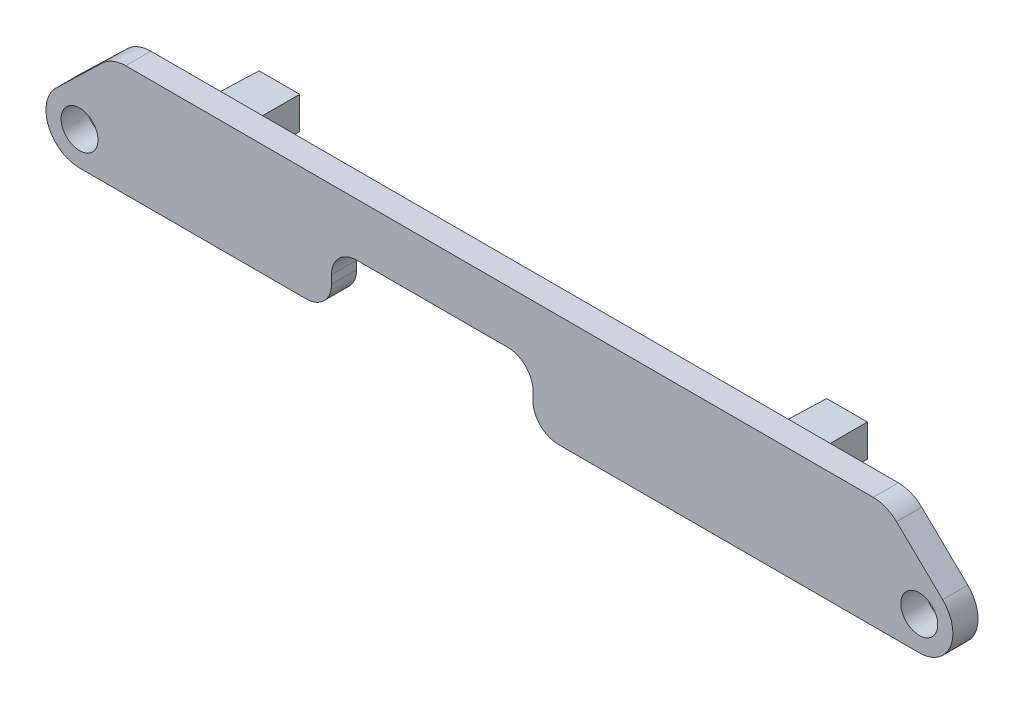
ISO-10303-21;
HEADER;
FILE_DESCRIPTION(('STEP AP214'),'2;1');
FILE_NAME('part.step','',(''),(''),'','','');
FILE_SCHEMA(('AUTOMOTIVE_DESIGN { 1 0 10303 214 1 1 1 1 }'));
ENDSEC;
DATA;
#1=APPLICATION_CONTEXT('core data for automotive mechanical design processes');
#2=APPLICATION_PROTOCOL_DEFINITION('international standard','automotive_design',2000,#1);
#3=PRODUCT_CONTEXT('',#1,'mechanical');
#4=PRODUCT('Part','Part','',(#3));
#5=PRODUCT_RELATED_PRODUCT_CATEGORY('part','',(#4));
#6=PRODUCT_DEFINITION_FORMATION('','',#4);
#7=PRODUCT_DEFINITION_CONTEXT('part definition',#1,'design');
#8=PRODUCT_DEFINITION('design','',#6,#7);
#9=PRODUCT_DEFINITION_SHAPE('','',#8);
#10=(LENGTH_UNIT() NAMED_UNIT(*) SI_UNIT(.MILLI.,.METRE.));
#11=(NAMED_UNIT(*) PLANE_ANGLE_UNIT() SI_UNIT($,.RADIAN.));
#12=(NAMED_UNIT(*) SI_UNIT($,.STERADIAN.) SOLID_ANGLE_UNIT());
#13=UNCERTAINTY_MEASURE_WITH_UNIT(LENGTH_MEASURE(1.E-05),#10,'distance_accuracy_value','');
#14=(GEOMETRIC_REPRESENTATION_CONTEXT(3) GLOBAL_UNCERTAINTY_ASSIGNED_CONTEXT((#13)) GLOBAL_UNIT_ASSIGNED_CONTEXT((#10,
#11,#12)) REPRESENTATION_CONTEXT('',''));
#15=CARTESIAN_POINT('',(0.,0.,0.));
#16=DIRECTION('',(0.,0.,1.));
#17=DIRECTION('',(1.,0.,0.));
#18=AXIS2_PLACEMENT_3D('',#15,#16,#17);
#19=CARTESIAN_POINT('',(-25.,-1.5,-1.5));
#20=DIRECTION('',(0.,0.,1.));
#21=DIRECTION('',(1.,0.,0.));
#22=AXIS2_PLACEMENT_3D('',#19,#20,#21);
#23=PLANE('',#22);
#24=DIRECTION('',(1.,0.,0.));
#25=VECTOR('',#24,1.);
#26=CARTESIAN_POINT('',(18.15,1.1,-1.5));
#27=LINE('',#26,#25);
#28=CARTESIAN_POINT('',(15.65,1.1,-1.5));
#29=VERTEX_POINT('',#28);
#30=CARTESIAN_POINT('',(18.15,1.1,-1.5));
#31=VERTEX_POINT('',#30);
#32=EDGE_CURVE('E207',#29,#31,#27,.T.);
#33=ORIENTED_EDGE('',*,*,#32,.T.);
#34=DIRECTION('',(0.,1.,0.));
#35=VECTOR('',#34,1.);
#36=CARTESIAN_POINT('',(18.15,1.1,-1.5));
#37=LINE('',#36,#35);
#38=CARTESIAN_POINT('',(18.15,3.1,-1.5));
#39=VERTEX_POINT('',#38);
#40=EDGE_CURVE('E219',#31,#39,#37,.T.);
#41=ORIENTED_EDGE('',*,*,#40,.T.);
#42=DIRECTION('',(-1.,0.,0.));
#43=VECTOR('',#42,1.);
#44=CARTESIAN_POINT('',(18.15,3.1,-1.5));
#45=LINE('',#44,#43);
#46=CARTESIAN_POINT('',(15.65,3.1,-1.5));
#47=VERTEX_POINT('',#46);
#48=EDGE_CURVE('E233',#39,#47,#45,.T.);
#49=ORIENTED_EDGE('',*,*,#48,.T.);
#50=DIRECTION('',(0.,-1.,0.));
#51=VECTOR('',#50,1.);
#52=CARTESIAN_POINT('',(15.65,1.1,-1.5));
#53=LINE('',#52,#51);
#54=EDGE_CURVE('E229',#47,#29,#53,.T.);
#55=ORIENTED_EDGE('',*,*,#54,.T.);
#56=EDGE_LOOP('',(#33,#41,#49,#55));
#57=FACE_BOUND('',#56,.T.);
#58=DIRECTION('',(0.,-1.,0.));
#59=VECTOR('',#58,1.);
#60=CARTESIAN_POINT('',(-10.,-3.5,-1.5));
#61=LINE('',#60,#59);
#62=CARTESIAN_POINT('',(-10.,-1.5,-1.5));
#63=VERTEX_POINT('',#62);
#64=CARTESIAN_POINT('',(-10.,-2.,-1.5));
#65=VERTEX_POINT('',#64);
#66=EDGE_CURVE('E322',#63,#65,#61,.T.);
#67=ORIENTED_EDGE('',*,*,#66,.T.);
#68=CARTESIAN_POINT('',(-11.5,-2.,-1.5));
#69=DIRECTION('',(0.,0.,1.));
#70=DIRECTION('',(1.,0.,0.));
#71=AXIS2_PLACEMENT_3D('',#68,#69,#70);
#72=CIRCLE('',#71,1.5);
#73=CARTESIAN_POINT('',(-11.5,-3.5,-1.5));
#74=VERTEX_POINT('',#73);
#75=EDGE_CURVE('E457',#65,#74,#72,.F.);
#76=ORIENTED_EDGE('',*,*,#75,.T.);
#77=DIRECTION('',(1.,0.,0.));
#78=VECTOR('',#77,1.);
#79=CARTESIAN_POINT('',(-25.,-3.5,-1.5));
#80=LINE('',#79,#78);
#81=CARTESIAN_POINT('',(-25.,-3.5,-1.5));
#82=VERTEX_POINT('',#81);
#83=EDGE_CURVE('E343',#82,#74,#80,.T.);
#84=ORIENTED_EDGE('',*,*,#83,.F.);
#85=CARTESIAN_POINT('',(-25.,-1.5,-1.5));
#86=DIRECTION('',(0.,0.,1.));
#87=DIRECTION('',(1.,0.,0.));
#88=AXIS2_PLACEMENT_3D('',#85,#86,#87);
#89=CIRCLE('',#88,2.);
#90=CARTESIAN_POINT('',(-26.389316740918,-0.0613203993226901,-1.5));
#91=VERTEX_POINT('',#90);
#92=EDGE_CURVE('E337',#91,#82,#89,.T.);
#93=ORIENTED_EDGE('',*,*,#92,.F.);
#94=DIRECTION('',(-0.719339800338655,-0.694658370458993,0.));
#95=VECTOR('',#94,1.);
#96=CARTESIAN_POINT('',(-26.389316740918,-0.0613203993226901,-1.5));
#97=LINE('',#96,#95);
#98=CARTESIAN_POINT('',(-23.645161409373,2.5886796006773,-1.5));
#99=VERTEX_POINT('',#98);
#100=EDGE_CURVE('E359',#99,#91,#97,.T.);
#101=ORIENTED_EDGE('',*,*,#100,.F.);
#102=CARTESIAN_POINT('',(-22.255844668455,1.15,-1.5));
#103=DIRECTION('',(0.,0.,1.));
#104=DIRECTION('',(1.,0.,0.));
#105=AXIS2_PLACEMENT_3D('',#102,#103,#104);
#106=CIRCLE('',#105,2.);
#107=CARTESIAN_POINT('',(-22.255844668455,3.15,-1.5));
#108=VERTEX_POINT('',#107);
#109=EDGE_CURVE('E415',#99,#108,#106,.F.);
#110=ORIENTED_EDGE('',*,*,#109,.T.);
#111=DIRECTION('',(-1.,0.,0.));
#112=VECTOR('',#111,1.);
#113=CARTESIAN_POINT('',(23.0638971201253,3.15,-1.5));
#114=LINE('',#113,#112);
#115=CARTESIAN_POINT('',(22.255844668455,3.15,-1.5));
#116=VERTEX_POINT('',#115);
#117=EDGE_CURVE('E355',#116,#108,#114,.T.);
#118=ORIENTED_EDGE('',*,*,#117,.F.);
#119=CARTESIAN_POINT('',(22.255844668455,1.15,-1.5));
#120=DIRECTION('',(0.,0.,1.));
#121=DIRECTION('',(1.,0.,0.));
#122=AXIS2_PLACEMENT_3D('',#119,#120,#121);
#123=CIRCLE('',#122,2.);
#124=CARTESIAN_POINT('',(23.645161409373,2.58867960067731,-1.5));
#125=VERTEX_POINT('',#124);
#126=EDGE_CURVE('E418',#116,#125,#123,.F.);
#127=ORIENTED_EDGE('',*,*,#126,.T.);
#128=DIRECTION('',(-0.719339800338655,0.694658370458993,0.));
#129=VECTOR('',#128,1.);
#130=CARTESIAN_POINT('',(26.389316740918,-0.0613203993226901,-1.5));
#131=LINE('',#130,#129);
#132=CARTESIAN_POINT('',(26.389316740918,-0.0613203993226905,-1.5));
#133=VERTEX_POINT('',#132);
#134=EDGE_CURVE('E351',#133,#125,#131,.T.);
#135=ORIENTED_EDGE('',*,*,#134,.F.);
#136=CARTESIAN_POINT('',(25.,-1.5,-1.5));
#137=DIRECTION('',(0.,0.,1.));
#138=DIRECTION('',(-1.,0.,0.));
#139=AXIS2_PLACEMENT_3D('',#136,#137,#138);
#140=CIRCLE('',#139,2.);
#141=CARTESIAN_POINT('',(25.,-3.5,-1.5));
#142=VERTEX_POINT('',#141);
#143=EDGE_CURVE('E347',#142,#133,#140,.T.);
#144=ORIENTED_EDGE('',*,*,#143,.F.);
#145=CARTESIAN_POINT('',(3.5,-3.5,-1.5));
#146=VERTEX_POINT('',#145);
#147=EDGE_CURVE('E341',#146,#142,#80,.T.);
#148=ORIENTED_EDGE('',*,*,#147,.F.);
#149=CARTESIAN_POINT('',(3.5,-2.,-1.5));
#150=DIRECTION('',(0.,0.,1.));
#151=DIRECTION('',(1.,0.,0.));
#152=AXIS2_PLACEMENT_3D('',#149,#150,#151);
#153=CIRCLE('',#152,1.5);
#154=CARTESIAN_POINT('',(2.,-2.,-1.5));
#155=VERTEX_POINT('',#154);
#156=EDGE_CURVE('E454',#146,#155,#153,.F.);
#157=ORIENTED_EDGE('',*,*,#156,.T.);
#158=DIRECTION('',(0.,1.,0.));
#159=VECTOR('',#158,1.);
#160=CARTESIAN_POINT('',(2.,-3.5,-1.5));
#161=LINE('',#160,#159);
#162=CARTESIAN_POINT('',(2.,-1.5,-1.5));
#163=VERTEX_POINT('',#162);
#164=EDGE_CURVE('E313',#155,#163,#161,.T.);
#165=ORIENTED_EDGE('',*,*,#164,.T.);
#166=CARTESIAN_POINT('',(0.500000000000001,-1.5,-1.5));
#167=DIRECTION('',(0.,0.,1.));
#168=DIRECTION('',(1.,0.,0.));
#169=AXIS2_PLACEMENT_3D('',#166,#167,#168);
#170=CIRCLE('',#169,1.5);
#171=CARTESIAN_POINT('',(0.5,0.,-1.5));
#172=VERTEX_POINT('',#171);
#173=EDGE_CURVE('E465',#163,#172,#170,.T.);
#174=ORIENTED_EDGE('',*,*,#173,.T.);
#175=DIRECTION('',(-1.,0.,0.));
#176=VECTOR('',#175,1.);
#177=CARTESIAN_POINT('',(2.,0.,-1.5));
#178=LINE('',#177,#176);
#179=CARTESIAN_POINT('',(-8.5,0.,-1.5));
#180=VERTEX_POINT('',#179);
#181=EDGE_CURVE('E317',#172,#180,#178,.T.);
#182=ORIENTED_EDGE('',*,*,#181,.T.);
#183=CARTESIAN_POINT('',(-8.5,-1.5,-1.5));
#184=DIRECTION('',(0.,0.,1.));
#185=DIRECTION('',(1.,0.,0.));
#186=AXIS2_PLACEMENT_3D('',#183,#184,#185);
#187=CIRCLE('',#186,1.5);
#188=EDGE_CURVE('E11',#180,#63,#187,.T.);
#189=ORIENTED_EDGE('',*,*,#188,.T.);
#190=EDGE_LOOP('',(#67,#76,#84,#93,#101,#110,#118,#127,#135,#144,#148,#157,#165,#174,#182,#189));
#191=FACE_BOUND('',#190,.T.);
#192=DIRECTION('',(0.,1.,0.));
#193=VECTOR('',#192,1.);
#194=CARTESIAN_POINT('',(-18.15,1.1,-1.5));
#195=LINE('',#194,#193);
#196=CARTESIAN_POINT('',(-18.15,1.1,-1.5));
#197=VERTEX_POINT('',#196);
#198=CARTESIAN_POINT('',(-18.15,3.1,-1.5));
#199=VERTEX_POINT('',#198);
#200=EDGE_CURVE('E267',#197,#199,#195,.T.);
#201=ORIENTED_EDGE('',*,*,#200,.F.);
#202=DIRECTION('',(-1.,0.,0.));
#203=VECTOR('',#202,1.);
#204=CARTESIAN_POINT('',(-18.15,1.1,-1.5));
#205=LINE('',#204,#203);
#206=CARTESIAN_POINT('',(-15.65,1.1,-1.5));
#207=VERTEX_POINT('',#206);
#208=EDGE_CURVE('E279',#207,#197,#205,.T.);
#209=ORIENTED_EDGE('',*,*,#208,.F.);
#210=DIRECTION('',(0.,-1.,0.));
#211=VECTOR('',#210,1.);
#212=CARTESIAN_POINT('',(-15.65,1.1,-1.5));
#213=LINE('',#212,#211);
#214=CARTESIAN_POINT('',(-15.65,3.1,-1.5));
#215=VERTEX_POINT('',#214);
#216=EDGE_CURVE('E275',#215,#207,#213,.T.);
#217=ORIENTED_EDGE('',*,*,#216,.F.);
#218=DIRECTION('',(1.,0.,0.));
#219=VECTOR('',#218,1.);
#220=CARTESIAN_POINT('',(-18.15,3.1,-1.5));
#221=LINE('',#220,#219);
#222=EDGE_CURVE('E271',#199,#215,#221,.T.);
#223=ORIENTED_EDGE('',*,*,#222,.F.);
#224=EDGE_LOOP('',(#201,#209,#217,#223));
#225=FACE_BOUND('',#224,.T.);
#226=CARTESIAN_POINT('',(-25.,-1.5,-1.5));
#227=DIRECTION('',(0.,0.,-1.));
#228=DIRECTION('',(-1.,0.,0.));
#229=AXIS2_PLACEMENT_3D('',#226,#227,#228);
#230=CIRCLE('',#229,1.1);
#231=CARTESIAN_POINT('',(-26.1,-1.5,-1.5));
#232=VERTEX_POINT('',#231);
#233=EDGE_CURVE('E215',#232,#232,#230,.T.);
#234=ORIENTED_EDGE('',*,*,#233,.F.);
#235=EDGE_LOOP('',(#234));
#236=FACE_BOUND('',#235,.T.);
#237=CARTESIAN_POINT('',(25.,-1.5,-1.5));
#238=DIRECTION('',(0.,0.,-1.));
#239=DIRECTION('',(-1.,0.,0.));
#240=AXIS2_PLACEMENT_3D('',#237,#238,#239);
#241=CIRCLE('',#240,1.1);
#242=CARTESIAN_POINT('',(23.9,-1.5,-1.5));
#243=VERTEX_POINT('',#242);
#244=EDGE_CURVE('E866',#243,#243,#241,.T.);
#245=ORIENTED_EDGE('',*,*,#244,.F.);
#246=EDGE_LOOP('',(#245));
#247=FACE_BOUND('',#246,.T.);
#248=ADVANCED_FACE('F42',(#57,#191,#225,#236,#247),#23,.F.);
#249=CARTESIAN_POINT('',(-25.,-1.5,0.));
#250=DIRECTION('',(0.,0.,1.));
#251=DIRECTION('',(1.,0.,0.));
#252=AXIS2_PLACEMENT_3D('',#249,#250,#251);
#253=PLANE('',#252);
#254=CARTESIAN_POINT('',(25.,-1.5,0.));
#255=DIRECTION('',(0.,0.,-1.));
#256=DIRECTION('',(-1.,0.,0.));
#257=AXIS2_PLACEMENT_3D('',#254,#255,#256);
#258=CIRCLE('',#257,1.1);
#259=CARTESIAN_POINT('',(23.9,-1.5,0.));
#260=VERTEX_POINT('',#259);
#261=EDGE_CURVE('E226',#260,#260,#258,.T.);
#262=ORIENTED_EDGE('',*,*,#261,.T.);
#263=EDGE_LOOP('',(#262));
#264=FACE_BOUND('',#263,.T.);
#265=DIRECTION('',(1.,0.,0.));
#266=VECTOR('',#265,1.);
#267=CARTESIAN_POINT('',(-25.,-3.5,0.));
#268=LINE('',#267,#266);
#269=CARTESIAN_POINT('',(-25.,-3.5,0.));
#270=VERTEX_POINT('',#269);
#271=CARTESIAN_POINT('',(-11.5,-3.5,0.));
#272=VERTEX_POINT('',#271);
#273=EDGE_CURVE('E367',#270,#272,#268,.T.);
#274=ORIENTED_EDGE('',*,*,#273,.T.);
#275=CARTESIAN_POINT('',(-11.5,-2.,0.));
#276=DIRECTION('',(0.,0.,1.));
#277=DIRECTION('',(1.,0.,0.));
#278=AXIS2_PLACEMENT_3D('',#275,#276,#277);
#279=CIRCLE('',#278,1.5);
#280=CARTESIAN_POINT('',(-10.,-2.,0.));
#281=VERTEX_POINT('',#280);
#282=EDGE_CURVE('E451',#272,#281,#279,.T.);
#283=ORIENTED_EDGE('',*,*,#282,.T.);
#284=DIRECTION('',(0.,-1.,0.));
#285=VECTOR('',#284,1.);
#286=CARTESIAN_POINT('',(-10.,-3.5,0.));
#287=LINE('',#286,#285);
#288=CARTESIAN_POINT('',(-10.,-1.5,0.));
#289=VERTEX_POINT('',#288);
#290=EDGE_CURVE('E318',#289,#281,#287,.T.);
#291=ORIENTED_EDGE('',*,*,#290,.F.);
#292=CARTESIAN_POINT('',(-8.5,-1.5,0.));
#293=DIRECTION('',(0.,0.,1.));
#294=DIRECTION('',(1.,0.,0.));
#295=AXIS2_PLACEMENT_3D('',#292,#293,#294);
#296=CIRCLE('',#295,1.5);
#297=CARTESIAN_POINT('',(-8.5,0.,0.));
#298=VERTEX_POINT('',#297);
#299=EDGE_CURVE('E51',#289,#298,#296,.F.);
#300=ORIENTED_EDGE('',*,*,#299,.T.);
#301=DIRECTION('',(-1.,0.,0.));
#302=VECTOR('',#301,1.);
#303=CARTESIAN_POINT('',(2.,0.,0.));
#304=LINE('',#303,#302);
#305=CARTESIAN_POINT('',(0.5,0.,0.));
#306=VERTEX_POINT('',#305);
#307=EDGE_CURVE('E330',#306,#298,#304,.T.);
#308=ORIENTED_EDGE('',*,*,#307,.F.);
#309=CARTESIAN_POINT('',(0.500000000000001,-1.5,0.));
#310=DIRECTION('',(0.,0.,1.));
#311=DIRECTION('',(1.,0.,0.));
#312=AXIS2_PLACEMENT_3D('',#309,#310,#311);
#313=CIRCLE('',#312,1.5);
#314=CARTESIAN_POINT('',(2.,-1.5,0.));
#315=VERTEX_POINT('',#314);
#316=EDGE_CURVE('E462',#306,#315,#313,.F.);
#317=ORIENTED_EDGE('',*,*,#316,.T.);
#318=DIRECTION('',(0.,1.,0.));
#319=VECTOR('',#318,1.);
#320=CARTESIAN_POINT('',(2.,-3.5,0.));
#321=LINE('',#320,#319);
#322=CARTESIAN_POINT('',(2.,-2.,0.));
#323=VERTEX_POINT('',#322);
#324=EDGE_CURVE('E288',#323,#315,#321,.T.);
#325=ORIENTED_EDGE('',*,*,#324,.F.);
#326=CARTESIAN_POINT('',(3.5,-2.,0.));
#327=DIRECTION('',(0.,0.,1.));
#328=DIRECTION('',(1.,0.,0.));
#329=AXIS2_PLACEMENT_3D('',#326,#327,#328);
#330=CIRCLE('',#329,1.5);
#331=CARTESIAN_POINT('',(3.5,-3.5,0.));
#332=VERTEX_POINT('',#331);
#333=EDGE_CURVE('E66',#323,#332,#330,.T.);
#334=ORIENTED_EDGE('',*,*,#333,.T.);
#335=CARTESIAN_POINT('',(25.,-3.5,0.));
#336=VERTEX_POINT('',#335);
#337=EDGE_CURVE('E366',#332,#336,#268,.T.);
#338=ORIENTED_EDGE('',*,*,#337,.T.);
#339=CARTESIAN_POINT('',(25.,-1.5,0.));
#340=DIRECTION('',(0.,0.,1.));
#341=DIRECTION('',(-1.,0.,0.));
#342=AXIS2_PLACEMENT_3D('',#339,#340,#341);
#343=CIRCLE('',#342,2.);
#344=CARTESIAN_POINT('',(26.389316740918,-0.0613203993226905,0.));
#345=VERTEX_POINT('',#344);
#346=EDGE_CURVE('E371',#336,#345,#343,.T.);
#347=ORIENTED_EDGE('',*,*,#346,.T.);
#348=DIRECTION('',(-0.719339800338655,0.694658370458993,0.));
#349=VECTOR('',#348,1.);
#350=CARTESIAN_POINT('',(26.389316740918,-0.0613203993226901,0.));
#351=LINE('',#350,#349);
#352=CARTESIAN_POINT('',(23.645161409373,2.58867960067731,0.));
#353=VERTEX_POINT('',#352);
#354=EDGE_CURVE('E375',#345,#353,#351,.T.);
#355=ORIENTED_EDGE('',*,*,#354,.T.);
#356=CARTESIAN_POINT('',(22.255844668455,1.15,0.));
#357=DIRECTION('',(0.,0.,1.));
#358=DIRECTION('',(1.,0.,0.));
#359=AXIS2_PLACEMENT_3D('',#356,#357,#358);
#360=CIRCLE('',#359,2.);
#361=CARTESIAN_POINT('',(22.255844668455,3.15,0.));
#362=VERTEX_POINT('',#361);
#363=EDGE_CURVE('E405',#353,#362,#360,.T.);
#364=ORIENTED_EDGE('',*,*,#363,.T.);
#365=DIRECTION('',(-1.,0.,0.));
#366=VECTOR('',#365,1.);
#367=CARTESIAN_POINT('',(23.0638971201253,3.15,0.));
#368=LINE('',#367,#366);
#369=CARTESIAN_POINT('',(-22.255844668455,3.15,0.));
#370=VERTEX_POINT('',#369);
#371=EDGE_CURVE('E379',#362,#370,#368,.T.);
#372=ORIENTED_EDGE('',*,*,#371,.T.);
#373=CARTESIAN_POINT('',(-22.255844668455,1.15,0.));
#374=DIRECTION('',(0.,0.,1.));
#375=DIRECTION('',(1.,0.,0.));
#376=AXIS2_PLACEMENT_3D('',#373,#374,#375);
#377=CIRCLE('',#376,2.);
#378=CARTESIAN_POINT('',(-23.645161409373,2.5886796006773,0.));
#379=VERTEX_POINT('',#378);
#380=EDGE_CURVE('E402',#370,#379,#377,.T.);
#381=ORIENTED_EDGE('',*,*,#380,.T.);
#382=DIRECTION('',(-0.719339800338655,-0.694658370458993,0.));
#383=VECTOR('',#382,1.);
#384=CARTESIAN_POINT('',(-26.389316740918,-0.0613203993226901,0.));
#385=LINE('',#384,#383);
#386=CARTESIAN_POINT('',(-26.389316740918,-0.0613203993226901,0.));
#387=VERTEX_POINT('',#386);
#388=EDGE_CURVE('E342',#379,#387,#385,.T.);
#389=ORIENTED_EDGE('',*,*,#388,.T.);
#390=CARTESIAN_POINT('',(-25.,-1.5,0.));
#391=DIRECTION('',(0.,0.,1.));
#392=DIRECTION('',(1.,0.,0.));
#393=AXIS2_PLACEMENT_3D('',#390,#391,#392);
#394=CIRCLE('',#393,2.);
#395=EDGE_CURVE('E326',#387,#270,#394,.T.);
#396=ORIENTED_EDGE('',*,*,#395,.T.);
#397=EDGE_LOOP('',(#274,#283,#291,#300,#308,#317,#325,#334,#338,#347,#355,#364,#372,#381,#389,#396));
#398=FACE_BOUND('',#397,.T.);
#399=CARTESIAN_POINT('',(-25.,-1.5,0.));
#400=DIRECTION('',(0.,0.,-1.));
#401=DIRECTION('',(-1.,0.,0.));
#402=AXIS2_PLACEMENT_3D('',#399,#400,#401);
#403=CIRCLE('',#402,1.1);
#404=CARTESIAN_POINT('',(-26.1,-1.5,0.));
#405=VERTEX_POINT('',#404);
#406=EDGE_CURVE('E263',#405,#405,#403,.T.);
#407=ORIENTED_EDGE('',*,*,#406,.T.);
#408=EDGE_LOOP('',(#407));
#409=FACE_BOUND('',#408,.T.);
#410=ADVANCED_FACE('F470',(#264,#398,#409),#253,.T.);
#411=CARTESIAN_POINT('',(-25.,-3.5,-1.5));
#412=DIRECTION('',(0.,-1.,0.));
#413=DIRECTION('',(0.,0.,-1.));
#414=AXIS2_PLACEMENT_3D('',#411,#412,#413);
#415=PLANE('',#414);
#416=ORIENTED_EDGE('',*,*,#337,.F.);
#417=DIRECTION('',(0.,0.,1.));
#418=VECTOR('',#417,1.);
#419=CARTESIAN_POINT('',(3.5,-3.5,-1.5));
#420=LINE('',#419,#418);
#421=EDGE_CURVE('E58',#332,#146,#420,.F.);
#422=ORIENTED_EDGE('',*,*,#421,.T.);
#423=ORIENTED_EDGE('',*,*,#147,.T.);
#424=DIRECTION('',(0.,0.,1.));
#425=VECTOR('',#424,1.);
#426=CARTESIAN_POINT('',(25.,-3.5,-1.5));
#427=LINE('',#426,#425);
#428=EDGE_CURVE('E393',#142,#336,#427,.T.);
#429=ORIENTED_EDGE('',*,*,#428,.T.);
#430=EDGE_LOOP('',(#416,#422,#423,#429));
#431=FACE_BOUND('',#430,.T.);
#432=ADVANCED_FACE('F525',(#431),#415,.T.);
#433=CARTESIAN_POINT('',(-25.,-1.5,-1.5));
#434=DIRECTION('',(0.,0.,1.));
#435=DIRECTION('',(1.,0.,0.));
#436=AXIS2_PLACEMENT_3D('',#433,#434,#435);
#437=CYLINDRICAL_SURFACE('',#436,2.);
#438=ORIENTED_EDGE('',*,*,#395,.F.);
#439=DIRECTION('',(0.,0.,1.));
#440=VECTOR('',#439,1.);
#441=CARTESIAN_POINT('',(-26.389316740918,-0.0613203993226901,-1.5));
#442=LINE('',#441,#440);
#443=EDGE_CURVE('E385',#91,#387,#442,.T.);
#444=ORIENTED_EDGE('',*,*,#443,.F.);
#445=ORIENTED_EDGE('',*,*,#92,.T.);
#446=DIRECTION('',(0.,0.,1.));
#447=VECTOR('',#446,1.);
#448=CARTESIAN_POINT('',(-25.,-3.5,-1.5));
#449=LINE('',#448,#447);
#450=EDGE_CURVE('E362',#82,#270,#449,.T.);
#451=ORIENTED_EDGE('',*,*,#450,.T.);
#452=EDGE_LOOP('',(#438,#444,#445,#451));
#453=FACE_BOUND('',#452,.T.);
#454=ADVANCED_FACE('F497',(#453),#437,.T.);
#455=CARTESIAN_POINT('',(-26.389316740918,-0.0613203993226901,-1.5));
#456=DIRECTION('',(-0.694658370458993,0.719339800338655,0.));
#457=DIRECTION('',(-0.719339800338655,-0.694658370458994,0.));
#458=AXIS2_PLACEMENT_3D('',#455,#456,#457);
#459=PLANE('',#458);
#460=ORIENTED_EDGE('',*,*,#388,.F.);
#461=DIRECTION('',(0.,0.,1.));
#462=VECTOR('',#461,1.);
#463=CARTESIAN_POINT('',(-23.645161409373,2.5886796006773,-1.5));
#464=LINE('',#463,#462);
#465=EDGE_CURVE('E421',#379,#99,#464,.F.);
#466=ORIENTED_EDGE('',*,*,#465,.T.);
#467=ORIENTED_EDGE('',*,*,#100,.T.);
#468=ORIENTED_EDGE('',*,*,#443,.T.);
#469=EDGE_LOOP('',(#460,#466,#467,#468));
#470=FACE_BOUND('',#469,.T.);
#471=ADVANCED_FACE('F560',(#470),#459,.T.);
#472=CARTESIAN_POINT('',(23.0638971201253,3.15,-1.5));
#473=DIRECTION('',(0.,1.,0.));
#474=DIRECTION('',(0.,0.,1.));
#475=AXIS2_PLACEMENT_3D('',#472,#473,#474);
#476=PLANE('',#475);
#477=ORIENTED_EDGE('',*,*,#371,.F.);
#478=DIRECTION('',(0.,0.,1.));
#479=VECTOR('',#478,1.);
#480=CARTESIAN_POINT('',(22.255844668455,3.15,-1.5));
#481=LINE('',#480,#479);
#482=EDGE_CURVE('E412',#362,#116,#481,.F.);
#483=ORIENTED_EDGE('',*,*,#482,.T.);
#484=ORIENTED_EDGE('',*,*,#117,.T.);
#485=DIRECTION('',(0.,0.,1.));
#486=VECTOR('',#485,1.);
#487=CARTESIAN_POINT('',(-22.255844668455,3.15,-1.5));
#488=LINE('',#487,#486);
#489=EDGE_CURVE('E408',#108,#370,#488,.T.);
#490=ORIENTED_EDGE('',*,*,#489,.T.);
#491=EDGE_LOOP('',(#477,#483,#484,#490));
#492=FACE_BOUND('',#491,.T.);
#493=ADVANCED_FACE('F509',(#492),#476,.T.);
#494=CARTESIAN_POINT('',(26.389316740918,-0.0613203993226901,-1.5));
#495=DIRECTION('',(0.694658370458993,0.719339800338655,0.));
#496=DIRECTION('',(-0.719339800338655,0.694658370458994,0.));
#497=AXIS2_PLACEMENT_3D('',#494,#495,#496);
#498=PLANE('',#497);
#499=ORIENTED_EDGE('',*,*,#134,.T.);
#500=DIRECTION('',(0.,0.,1.));
#501=VECTOR('',#500,1.);
#502=CARTESIAN_POINT('',(23.645161409373,2.58867960067731,-1.5));
#503=LINE('',#502,#501);
#504=EDGE_CURVE('E389',#125,#353,#503,.T.);
#505=ORIENTED_EDGE('',*,*,#504,.T.);
#506=ORIENTED_EDGE('',*,*,#354,.F.);
#507=DIRECTION('',(0.,0.,1.));
#508=VECTOR('',#507,1.);
#509=CARTESIAN_POINT('',(26.389316740918,-0.0613203993226905,-1.5));
#510=LINE('',#509,#508);
#511=EDGE_CURVE('E390',#133,#345,#510,.T.);
#512=ORIENTED_EDGE('',*,*,#511,.F.);
#513=EDGE_LOOP('',(#499,#505,#506,#512));
#514=FACE_BOUND('',#513,.T.);
#515=ADVANCED_FACE('F518',(#514),#498,.T.);
#516=CARTESIAN_POINT('',(25.,-1.5,-1.5));
#517=DIRECTION('',(0.,0.,1.));
#518=DIRECTION('',(1.,0.,0.));
#519=AXIS2_PLACEMENT_3D('',#516,#517,#518);
#520=CYLINDRICAL_SURFACE('',#519,2.);
#521=ORIENTED_EDGE('',*,*,#346,.F.);
#522=ORIENTED_EDGE('',*,*,#428,.F.);
#523=ORIENTED_EDGE('',*,*,#143,.T.);
#524=ORIENTED_EDGE('',*,*,#511,.T.);
#525=EDGE_LOOP('',(#521,#522,#523,#524));
#526=FACE_BOUND('',#525,.T.);
#527=ADVANCED_FACE('F524',(#526),#520,.T.);
#528=ORIENTED_EDGE('',*,*,#83,.T.);
#529=DIRECTION('',(0.,0.,1.));
#530=VECTOR('',#529,1.);
#531=CARTESIAN_POINT('',(-11.5,-3.5,0.));
#532=LINE('',#531,#530);
#533=EDGE_CURVE('E445',#74,#272,#532,.T.);
#534=ORIENTED_EDGE('',*,*,#533,.T.);
#535=ORIENTED_EDGE('',*,*,#273,.F.);
#536=ORIENTED_EDGE('',*,*,#450,.F.);
#537=EDGE_LOOP('',(#528,#534,#535,#536));
#538=FACE_BOUND('',#537,.T.);
#539=ADVANCED_FACE('F493',(#538),#415,.T.);
#540=CARTESIAN_POINT('',(22.255844668455,1.15,-1.5));
#541=DIRECTION('',(0.,0.,1.));
#542=DIRECTION('',(1.,0.,0.));
#543=AXIS2_PLACEMENT_3D('',#540,#541,#542);
#544=CYLINDRICAL_SURFACE('',#543,2.);
#545=ORIENTED_EDGE('',*,*,#126,.F.);
#546=ORIENTED_EDGE('',*,*,#482,.F.);
#547=ORIENTED_EDGE('',*,*,#363,.F.);
#548=ORIENTED_EDGE('',*,*,#504,.F.);
#549=EDGE_LOOP('',(#545,#546,#547,#548));
#550=FACE_BOUND('',#549,.T.);
#551=ADVANCED_FACE('F516',(#550),#544,.T.);
#552=CARTESIAN_POINT('',(-22.255844668455,1.15,-1.5));
#553=DIRECTION('',(0.,0.,1.));
#554=DIRECTION('',(1.,0.,0.));
#555=AXIS2_PLACEMENT_3D('',#552,#553,#554);
#556=CYLINDRICAL_SURFACE('',#555,2.);
#557=ORIENTED_EDGE('',*,*,#109,.F.);
#558=ORIENTED_EDGE('',*,*,#465,.F.);
#559=ORIENTED_EDGE('',*,*,#380,.F.);
#560=ORIENTED_EDGE('',*,*,#489,.F.);
#561=EDGE_LOOP('',(#557,#558,#559,#560));
#562=FACE_BOUND('',#561,.T.);
#563=ADVANCED_FACE('F506',(#562),#556,.T.);
#564=CARTESIAN_POINT('',(2.,-3.5,-1.5));
#565=DIRECTION('',(1.,0.,0.));
#566=DIRECTION('',(0.,1.,0.));
#567=AXIS2_PLACEMENT_3D('',#564,#565,#566);
#568=PLANE('',#567);
#569=ORIENTED_EDGE('',*,*,#324,.T.);
#570=DIRECTION('',(0.,0.,1.));
#571=VECTOR('',#570,1.);
#572=CARTESIAN_POINT('',(2.,-1.5,-1.5));
#573=LINE('',#572,#571);
#574=EDGE_CURVE('E435',#315,#163,#573,.F.);
#575=ORIENTED_EDGE('',*,*,#574,.T.);
#576=ORIENTED_EDGE('',*,*,#164,.F.);
#577=DIRECTION('',(0.,0.,1.));
#578=VECTOR('',#577,1.);
#579=CARTESIAN_POINT('',(2.,-2.,0.));
#580=LINE('',#579,#578);
#581=EDGE_CURVE('E431',#155,#323,#580,.T.);
#582=ORIENTED_EDGE('',*,*,#581,.T.);
#583=EDGE_LOOP('',(#569,#575,#576,#582));
#584=FACE_BOUND('',#583,.T.);
#585=ADVANCED_FACE('F533',(#584),#568,.F.);
#586=CARTESIAN_POINT('',(-10.,-3.5,-1.5));
#587=DIRECTION('',(-1.,0.,0.));
#588=DIRECTION('',(0.,0.,1.));
#589=AXIS2_PLACEMENT_3D('',#586,#587,#588);
#590=PLANE('',#589);
#591=ORIENTED_EDGE('',*,*,#66,.F.);
#592=DIRECTION('',(0.,0.,1.));
#593=VECTOR('',#592,1.);
#594=CARTESIAN_POINT('',(-10.,-1.5,0.));
#595=LINE('',#594,#593);
#596=EDGE_CURVE('E441',#63,#289,#595,.T.);
#597=ORIENTED_EDGE('',*,*,#596,.T.);
#598=ORIENTED_EDGE('',*,*,#290,.T.);
#599=DIRECTION('',(0.,0.,1.));
#600=VECTOR('',#599,1.);
#601=CARTESIAN_POINT('',(-10.,-2.,-1.5));
#602=LINE('',#601,#600);
#603=EDGE_CURVE('E438',#281,#65,#602,.F.);
#604=ORIENTED_EDGE('',*,*,#603,.T.);
#605=EDGE_LOOP('',(#591,#597,#598,#604));
#606=FACE_BOUND('',#605,.T.);
#607=ADVANCED_FACE('F485',(#606),#590,.F.);
#608=CARTESIAN_POINT('',(2.,0.,-1.5));
#609=DIRECTION('',(0.,1.,0.));
#610=DIRECTION('',(-1.,0.,0.));
#611=AXIS2_PLACEMENT_3D('',#608,#609,#610);
#612=PLANE('',#611);
#613=ORIENTED_EDGE('',*,*,#181,.F.);
#614=DIRECTION('',(0.,0.,1.));
#615=VECTOR('',#614,1.);
#616=CARTESIAN_POINT('',(0.5,0.,0.));
#617=LINE('',#616,#615);
#618=EDGE_CURVE('E427',#172,#306,#617,.T.);
#619=ORIENTED_EDGE('',*,*,#618,.T.);
#620=ORIENTED_EDGE('',*,*,#307,.T.);
#621=DIRECTION('',(0.,0.,1.));
#622=VECTOR('',#621,1.);
#623=CARTESIAN_POINT('',(-8.5,0.,-1.5));
#624=LINE('',#623,#622);
#625=EDGE_CURVE('E424',#298,#180,#624,.F.);
#626=ORIENTED_EDGE('',*,*,#625,.T.);
#627=EDGE_LOOP('',(#613,#619,#620,#626));
#628=FACE_BOUND('',#627,.T.);
#629=ADVANCED_FACE('F477',(#628),#612,.F.);
#630=CARTESIAN_POINT('',(-18.15,1.1,-1.5));
#631=DIRECTION('',(-0.999847695156391,0.,-0.0174524064372835));
#632=DIRECTION('',(-0.0174524064372835,0.,0.999847695156391));
#633=AXIS2_PLACEMENT_3D('',#630,#631,#632);
#634=PLANE('',#633);
#635=ORIENTED_EDGE('',*,*,#200,.T.);
#636=DIRECTION('',(-0.0174497491606827,0.0174497491606827,0.999695459881887));
#637=VECTOR('',#636,1.);
#638=CARTESIAN_POINT('',(-18.15,3.1,-1.5));
#639=LINE('',#638,#637);
#640=CARTESIAN_POINT('',(-18.1098533506651,3.0598533506651,-3.8));
#641=VERTEX_POINT('',#640);
#642=EDGE_CURVE('E284',#641,#199,#639,.T.);
#643=ORIENTED_EDGE('',*,*,#642,.F.);
#644=DIRECTION('',(0.,-1.,0.));
#645=VECTOR('',#644,1.);
#646=CARTESIAN_POINT('',(-18.1098533506651,1.1,-3.8));
#647=LINE('',#646,#645);
#648=CARTESIAN_POINT('',(-18.1098533506651,1.1401466493349,-3.8));
#649=VERTEX_POINT('',#648);
#650=EDGE_CURVE('E283',#649,#641,#647,.F.);
#651=ORIENTED_EDGE('',*,*,#650,.F.);
#652=DIRECTION('',(-0.0174497491606827,-0.0174497491606827,0.999695459881887));
#653=VECTOR('',#652,1.);
#654=CARTESIAN_POINT('',(-18.15,1.1,-1.5));
#655=LINE('',#654,#653);
#656=EDGE_CURVE('E290',#649,#197,#655,.T.);
#657=ORIENTED_EDGE('',*,*,#656,.T.);
#658=EDGE_LOOP('',(#635,#643,#651,#657));
#659=FACE_BOUND('',#658,.T.);
#660=ADVANCED_FACE('F585',(#659),#634,.T.);
#661=CARTESIAN_POINT('',(-18.15,3.1,-1.5));
#662=DIRECTION('',(0.,0.999847695156391,-0.0174524064372835));
#663=DIRECTION('',(0.,0.0174524064372835,0.999847695156391));
#664=AXIS2_PLACEMENT_3D('',#661,#662,#663);
#665=PLANE('',#664);
#666=ORIENTED_EDGE('',*,*,#222,.T.);
#667=DIRECTION('',(0.0174497491606827,0.0174497491606827,0.999695459881887));
#668=VECTOR('',#667,1.);
#669=CARTESIAN_POINT('',(-15.6506089874915,3.09939101250846,-1.53488887002402));
#670=LINE('',#669,#668);
#671=CARTESIAN_POINT('',(-15.6901466493349,3.0598533506651,-3.8));
#672=VERTEX_POINT('',#671);
#673=EDGE_CURVE('E289',#672,#215,#670,.T.);
#674=ORIENTED_EDGE('',*,*,#673,.F.);
#675=DIRECTION('',(-1.,0.,0.));
#676=VECTOR('',#675,1.);
#677=CARTESIAN_POINT('',(-18.15,3.0598533506651,-3.8));
#678=LINE('',#677,#676);
#679=EDGE_CURVE('E305',#641,#672,#678,.F.);
#680=ORIENTED_EDGE('',*,*,#679,.F.);
#681=ORIENTED_EDGE('',*,*,#642,.T.);
#682=EDGE_LOOP('',(#666,#674,#680,#681));
#683=FACE_BOUND('',#682,.T.);
#684=ADVANCED_FACE('F587',(#683),#665,.T.);
#685=CARTESIAN_POINT('',(-15.65,1.1,-1.5));
#686=DIRECTION('',(0.999847695156391,0.,-0.0174524064372835));
#687=DIRECTION('',(-0.0174524064372835,0.,-0.999847695156391));
#688=AXIS2_PLACEMENT_3D('',#685,#686,#687);
#689=PLANE('',#688);
#690=ORIENTED_EDGE('',*,*,#216,.T.);
#691=DIRECTION('',(0.0174497491606827,-0.0174497491606827,0.999695459881887));
#692=VECTOR('',#691,1.);
#693=CARTESIAN_POINT('',(-15.6507612343644,1.10076123436443,-1.54361108753003));
#694=LINE('',#693,#692);
#695=CARTESIAN_POINT('',(-15.6901466493349,1.1401466493349,-3.8));
#696=VERTEX_POINT('',#695);
#697=EDGE_CURVE('E294',#696,#207,#694,.T.);
#698=ORIENTED_EDGE('',*,*,#697,.F.);
#699=DIRECTION('',(0.,1.,0.));
#700=VECTOR('',#699,1.);
#701=CARTESIAN_POINT('',(-15.6901466493349,1.1,-3.8));
#702=LINE('',#701,#700);
#703=EDGE_CURVE('E308',#672,#696,#702,.F.);
#704=ORIENTED_EDGE('',*,*,#703,.F.);
#705=ORIENTED_EDGE('',*,*,#673,.T.);
#706=EDGE_LOOP('',(#690,#698,#704,#705));
#707=FACE_BOUND('',#706,.T.);
#708=ADVANCED_FACE('F590',(#707),#689,.T.);
#709=CARTESIAN_POINT('',(-18.15,1.1,-1.5));
#710=DIRECTION('',(0.,-0.999847695156391,-0.0174524064372835));
#711=DIRECTION('',(0.,0.0174524064372835,-0.999847695156391));
#712=AXIS2_PLACEMENT_3D('',#709,#710,#711);
#713=PLANE('',#712);
#714=ORIENTED_EDGE('',*,*,#208,.T.);
#715=ORIENTED_EDGE('',*,*,#656,.F.);
#716=DIRECTION('',(1.,0.,0.));
#717=VECTOR('',#716,1.);
#718=CARTESIAN_POINT('',(-18.15,1.1401466493349,-3.8));
#719=LINE('',#718,#717);
#720=EDGE_CURVE('E295',#696,#649,#719,.F.);
#721=ORIENTED_EDGE('',*,*,#720,.F.);
#722=ORIENTED_EDGE('',*,*,#697,.T.);
#723=EDGE_LOOP('',(#714,#715,#721,#722));
#724=FACE_BOUND('',#723,.T.);
#725=ADVANCED_FACE('F594',(#724),#713,.T.);
#726=CARTESIAN_POINT('',(0.,0.,-3.8));
#727=DIRECTION('',(0.,0.,-1.));
#728=DIRECTION('',(-1.,0.,0.));
#729=AXIS2_PLACEMENT_3D('',#726,#727,#728);
#730=PLANE('',#729);
#731=ORIENTED_EDGE('',*,*,#650,.T.);
#732=ORIENTED_EDGE('',*,*,#679,.T.);
#733=ORIENTED_EDGE('',*,*,#703,.T.);
#734=ORIENTED_EDGE('',*,*,#720,.T.);
#735=EDGE_LOOP('',(#731,#732,#733,#734));
#736=FACE_BOUND('',#735,.T.);
#737=ADVANCED_FACE('F598',(#736),#730,.T.);
#738=CARTESIAN_POINT('',(-25.,-1.5,-1.5));
#739=DIRECTION('',(0.,0.,-1.));
#740=DIRECTION('',(-1.,0.,0.));
#741=AXIS2_PLACEMENT_3D('',#738,#739,#740);
#742=CYLINDRICAL_SURFACE('',#741,1.1);
#743=ORIENTED_EDGE('',*,*,#406,.F.);
#744=EDGE_LOOP('',(#743));
#745=FACE_BOUND('',#744,.T.);
#746=ORIENTED_EDGE('',*,*,#233,.T.);
#747=EDGE_LOOP('',(#746));
#748=FACE_BOUND('',#747,.T.);
#749=ADVANCED_FACE('F605',(#745,#748),#742,.F.);
#750=CARTESIAN_POINT('',(18.15,1.1,-1.5));
#751=DIRECTION('',(0.999847695156391,0.,-0.0174524064372835));
#752=DIRECTION('',(-0.0174524064372835,0.,-0.999847695156391));
#753=AXIS2_PLACEMENT_3D('',#750,#751,#752);
#754=PLANE('',#753);
#755=ORIENTED_EDGE('',*,*,#40,.F.);
#756=DIRECTION('',(0.0174497491606827,-0.0174497491606827,0.999695459881887));
#757=VECTOR('',#756,1.);
#758=CARTESIAN_POINT('',(18.15,1.1,-1.5));
#759=LINE('',#758,#757);
#760=CARTESIAN_POINT('',(18.1098533506651,1.1401466493349,-3.8));
#761=VERTEX_POINT('',#760);
#762=EDGE_CURVE('E203',#761,#31,#759,.T.);
#763=ORIENTED_EDGE('',*,*,#762,.F.);
#764=DIRECTION('',(0.,1.,0.));
#765=VECTOR('',#764,1.);
#766=CARTESIAN_POINT('',(18.1098533506651,1.1,-3.8));
#767=LINE('',#766,#765);
#768=CARTESIAN_POINT('',(18.1098533506651,3.0598533506651,-3.8));
#769=VERTEX_POINT('',#768);
#770=EDGE_CURVE('E238',#761,#769,#767,.T.);
#771=ORIENTED_EDGE('',*,*,#770,.T.);
#772=DIRECTION('',(0.0174497491606827,0.0174497491606827,0.999695459881887));
#773=VECTOR('',#772,1.);
#774=CARTESIAN_POINT('',(18.1493910125085,3.09939101250846,-1.53488887002402));
#775=LINE('',#774,#773);
#776=EDGE_CURVE('E221',#769,#39,#775,.T.);
#777=ORIENTED_EDGE('',*,*,#776,.T.);
#778=EDGE_LOOP('',(#755,#763,#771,#777));
#779=FACE_BOUND('',#778,.T.);
#780=ADVANCED_FACE('F220',(#779),#754,.T.);
#781=CARTESIAN_POINT('',(18.15,1.1,-1.5));
#782=DIRECTION('',(0.,-0.999847695156391,-0.0174524064372835));
#783=DIRECTION('',(0.,0.0174524064372835,-0.999847695156391));
#784=AXIS2_PLACEMENT_3D('',#781,#782,#783);
#785=PLANE('',#784);
#786=ORIENTED_EDGE('',*,*,#32,.F.);
#787=DIRECTION('',(-0.0174497491606827,-0.0174497491606827,0.999695459881887));
#788=VECTOR('',#787,1.);
#789=CARTESIAN_POINT('',(15.65,1.1,-1.5));
#790=LINE('',#789,#788);
#791=CARTESIAN_POINT('',(15.6901466493349,1.1401466493349,-3.8));
#792=VERTEX_POINT('',#791);
#793=EDGE_CURVE('E216',#792,#29,#790,.T.);
#794=ORIENTED_EDGE('',*,*,#793,.F.);
#795=DIRECTION('',(1.,0.,0.));
#796=VECTOR('',#795,1.);
#797=CARTESIAN_POINT('',(18.15,1.1401466493349,-3.8));
#798=LINE('',#797,#796);
#799=EDGE_CURVE('E210',#792,#761,#798,.T.);
#800=ORIENTED_EDGE('',*,*,#799,.T.);
#801=ORIENTED_EDGE('',*,*,#762,.T.);
#802=EDGE_LOOP('',(#786,#794,#800,#801));
#803=FACE_BOUND('',#802,.T.);
#804=ADVANCED_FACE('F205',(#803),#785,.T.);
#805=CARTESIAN_POINT('',(15.65,1.1,-1.5));
#806=DIRECTION('',(-0.999847695156391,0.,-0.0174524064372835));
#807=DIRECTION('',(-0.0174524064372835,0.,0.999847695156391));
#808=AXIS2_PLACEMENT_3D('',#805,#806,#807);
#809=PLANE('',#808);
#810=ORIENTED_EDGE('',*,*,#54,.F.);
#811=DIRECTION('',(-0.0174497491606827,0.0174497491606827,0.999695459881887));
#812=VECTOR('',#811,1.);
#813=CARTESIAN_POINT('',(15.6507612343644,3.09923876563557,-1.54361108753003));
#814=LINE('',#813,#812);
#815=CARTESIAN_POINT('',(15.6901466493349,3.0598533506651,-3.8));
#816=VERTEX_POINT('',#815);
#817=EDGE_CURVE('E242',#816,#47,#814,.T.);
#818=ORIENTED_EDGE('',*,*,#817,.F.);
#819=DIRECTION('',(0.,-1.,0.));
#820=VECTOR('',#819,1.);
#821=CARTESIAN_POINT('',(15.6901466493349,1.1,-3.8));
#822=LINE('',#821,#820);
#823=EDGE_CURVE('E253',#816,#792,#822,.T.);
#824=ORIENTED_EDGE('',*,*,#823,.T.);
#825=ORIENTED_EDGE('',*,*,#793,.T.);
#826=EDGE_LOOP('',(#810,#818,#824,#825));
#827=FACE_BOUND('',#826,.T.);
#828=ADVANCED_FACE('F612',(#827),#809,.T.);
#829=CARTESIAN_POINT('',(18.15,3.1,-1.5));
#830=DIRECTION('',(0.,0.999847695156391,-0.0174524064372835));
#831=DIRECTION('',(0.,0.0174524064372835,0.999847695156391));
#832=AXIS2_PLACEMENT_3D('',#829,#830,#831);
#833=PLANE('',#832);
#834=ORIENTED_EDGE('',*,*,#48,.F.);
#835=ORIENTED_EDGE('',*,*,#776,.F.);
#836=DIRECTION('',(-1.,0.,0.));
#837=VECTOR('',#836,1.);
#838=CARTESIAN_POINT('',(18.15,3.0598533506651,-3.8));
#839=LINE('',#838,#837);
#840=EDGE_CURVE('E243',#769,#816,#839,.T.);
#841=ORIENTED_EDGE('',*,*,#840,.T.);
#842=ORIENTED_EDGE('',*,*,#817,.T.);
#843=EDGE_LOOP('',(#834,#835,#841,#842));
#844=FACE_BOUND('',#843,.T.);
#845=ADVANCED_FACE('F615',(#844),#833,.T.);
#846=CARTESIAN_POINT('',(0.,0.,-3.8));
#847=DIRECTION('',(0.,0.,-1.));
#848=DIRECTION('',(1.,0.,0.));
#849=AXIS2_PLACEMENT_3D('',#846,#847,#848);
#850=PLANE('',#849);
#851=ORIENTED_EDGE('',*,*,#770,.F.);
#852=ORIENTED_EDGE('',*,*,#799,.F.);
#853=ORIENTED_EDGE('',*,*,#823,.F.);
#854=ORIENTED_EDGE('',*,*,#840,.F.);
#855=EDGE_LOOP('',(#851,#852,#853,#854));
#856=FACE_BOUND('',#855,.T.);
#857=ADVANCED_FACE('F546',(#856),#850,.T.);
#858=CARTESIAN_POINT('',(25.,-1.5,-1.5));
#859=DIRECTION('',(0.,0.,-1.));
#860=DIRECTION('',(-1.,0.,0.));
#861=AXIS2_PLACEMENT_3D('',#858,#859,#860);
#862=CYLINDRICAL_SURFACE('',#861,1.1);
#863=ORIENTED_EDGE('',*,*,#261,.F.);
#864=EDGE_LOOP('',(#863));
#865=FACE_BOUND('',#864,.T.);
#866=ORIENTED_EDGE('',*,*,#244,.T.);
#867=EDGE_LOOP('',(#866));
#868=FACE_BOUND('',#867,.T.);
#869=ADVANCED_FACE('F539',(#865,#868),#862,.F.);
#870=CARTESIAN_POINT('',(0.500000000000001,-1.5,-1.5));
#871=DIRECTION('',(0.,0.,-1.));
#872=DIRECTION('',(-1.,0.,0.));
#873=AXIS2_PLACEMENT_3D('',#870,#871,#872);
#874=CYLINDRICAL_SURFACE('',#873,1.5);
#875=ORIENTED_EDGE('',*,*,#173,.F.);
#876=ORIENTED_EDGE('',*,*,#574,.F.);
#877=ORIENTED_EDGE('',*,*,#316,.F.);
#878=ORIENTED_EDGE('',*,*,#618,.F.);
#879=EDGE_LOOP('',(#875,#876,#877,#878));
#880=FACE_BOUND('',#879,.T.);
#881=ADVANCED_FACE('F537',(#880),#874,.F.);
#882=CARTESIAN_POINT('',(-8.5,-1.5,-1.5));
#883=DIRECTION('',(0.,0.,-1.));
#884=DIRECTION('',(-1.,0.,0.));
#885=AXIS2_PLACEMENT_3D('',#882,#883,#884);
#886=CYLINDRICAL_SURFACE('',#885,1.5);
#887=ORIENTED_EDGE('',*,*,#188,.F.);
#888=ORIENTED_EDGE('',*,*,#625,.F.);
#889=ORIENTED_EDGE('',*,*,#299,.F.);
#890=ORIENTED_EDGE('',*,*,#596,.F.);
#891=EDGE_LOOP('',(#887,#888,#889,#890));
#892=FACE_BOUND('',#891,.T.);
#893=ADVANCED_FACE('F480',(#892),#886,.F.);
#894=CARTESIAN_POINT('',(-11.5,-2.,-1.5));
#895=DIRECTION('',(0.,0.,-1.));
#896=DIRECTION('',(-1.,0.,0.));
#897=AXIS2_PLACEMENT_3D('',#894,#895,#896);
#898=CYLINDRICAL_SURFACE('',#897,1.5);
#899=ORIENTED_EDGE('',*,*,#75,.F.);
#900=ORIENTED_EDGE('',*,*,#603,.F.);
#901=ORIENTED_EDGE('',*,*,#282,.F.);
#902=ORIENTED_EDGE('',*,*,#533,.F.);
#903=EDGE_LOOP('',(#899,#900,#901,#902));
#904=FACE_BOUND('',#903,.T.);
#905=ADVANCED_FACE('F488',(#904),#898,.T.);
#906=CARTESIAN_POINT('',(3.5,-2.,-1.5));
#907=DIRECTION('',(0.,0.,-1.));
#908=DIRECTION('',(-1.,0.,0.));
#909=AXIS2_PLACEMENT_3D('',#906,#907,#908);
#910=CYLINDRICAL_SURFACE('',#909,1.5);
#911=ORIENTED_EDGE('',*,*,#156,.F.);
#912=ORIENTED_EDGE('',*,*,#421,.F.);
#913=ORIENTED_EDGE('',*,*,#333,.F.);
#914=ORIENTED_EDGE('',*,*,#581,.F.);
#915=EDGE_LOOP('',(#911,#912,#913,#914));
#916=FACE_BOUND('',#915,.T.);
#917=ADVANCED_FACE('F44',(#916),#910,.T.);
#918=CLOSED_SHELL('',(#248,#410,#432,#454,#471,#493,#515,#527,#539,#551,#563,#585,#607,#629,
#660,#684,#708,#725,#737,#749,#780,#804,#828,#845,#857,#869,#881,#893,#905,#917));
#919=MANIFOLD_SOLID_BREP('B2',#918);
#920=ADVANCED_BREP_SHAPE_REPRESENTATION('',(#18,#919),#14);
#921=SHAPE_DEFINITION_REPRESENTATION(#9,#920);
ENDSEC;
END-ISO-10303-21;
